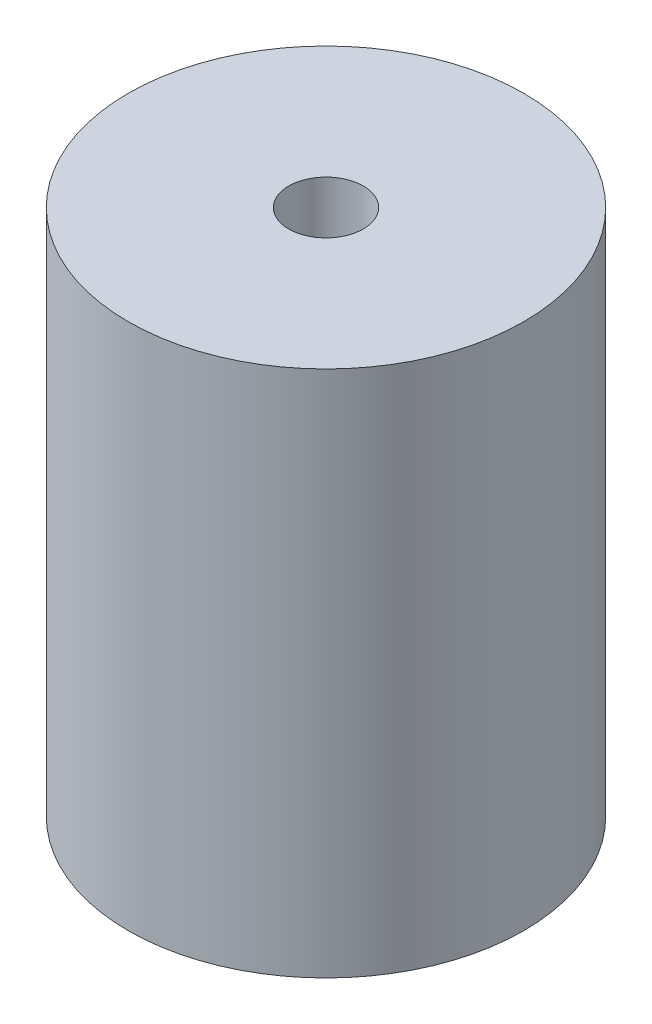
ISO-10303-21;
HEADER;
FILE_DESCRIPTION(('STEP AP214'),'2;1');
FILE_NAME('part.step','',(''),(''),'','','');
FILE_SCHEMA(('AUTOMOTIVE_DESIGN { 1 0 10303 214 1 1 1 1 }'));
ENDSEC;
DATA;
#1=APPLICATION_CONTEXT('core data for automotive mechanical design processes');
#2=APPLICATION_PROTOCOL_DEFINITION('international standard','automotive_design',2000,#1);
#3=PRODUCT_CONTEXT('',#1,'mechanical');
#4=PRODUCT('Part','Part','',(#3));
#5=PRODUCT_RELATED_PRODUCT_CATEGORY('part','',(#4));
#6=PRODUCT_DEFINITION_FORMATION('','',#4);
#7=PRODUCT_DEFINITION_CONTEXT('part definition',#1,'design');
#8=PRODUCT_DEFINITION('design','',#6,#7);
#9=PRODUCT_DEFINITION_SHAPE('','',#8);
#10=(LENGTH_UNIT() NAMED_UNIT(*) SI_UNIT(.MILLI.,.METRE.));
#11=(NAMED_UNIT(*) PLANE_ANGLE_UNIT() SI_UNIT($,.RADIAN.));
#12=(NAMED_UNIT(*) SI_UNIT($,.STERADIAN.) SOLID_ANGLE_UNIT());
#13=UNCERTAINTY_MEASURE_WITH_UNIT(LENGTH_MEASURE(1.E-05),#10,'distance_accuracy_value','');
#14=(GEOMETRIC_REPRESENTATION_CONTEXT(3) GLOBAL_UNCERTAINTY_ASSIGNED_CONTEXT((#13)) GLOBAL_UNIT_ASSIGNED_CONTEXT((#10,
#11,#12)) REPRESENTATION_CONTEXT('',''));
#15=CARTESIAN_POINT('',(0.,0.,0.));
#16=DIRECTION('',(0.,0.,1.));
#17=DIRECTION('',(1.,0.,0.));
#18=AXIS2_PLACEMENT_3D('',#15,#16,#17);
#19=CARTESIAN_POINT('',(0.,101.6,0.));
#20=DIRECTION('',(0.,-1.,0.));
#21=DIRECTION('',(0.,0.,-1.));
#22=AXIS2_PLACEMENT_3D('',#19,#20,#21);
#23=CYLINDRICAL_SURFACE('',#22,38.1);
#24=CARTESIAN_POINT('',(0.,101.6,0.));
#25=DIRECTION('',(0.,1.,0.));
#26=DIRECTION('',(0.,0.,1.));
#27=AXIS2_PLACEMENT_3D('',#24,#25,#26);
#28=CIRCLE('',#27,38.1);
#29=CARTESIAN_POINT('',(0.,101.6,38.1));
#30=VERTEX_POINT('',#29);
#31=EDGE_CURVE('E10',#30,#30,#28,.T.);
#32=ORIENTED_EDGE('',*,*,#31,.F.);
#33=EDGE_LOOP('',(#32));
#34=FACE_BOUND('',#33,.T.);
#35=CARTESIAN_POINT('',(0.,0.,0.));
#36=DIRECTION('',(0.,1.,0.));
#37=DIRECTION('',(0.,0.,1.));
#38=AXIS2_PLACEMENT_3D('',#35,#36,#37);
#39=CIRCLE('',#38,38.1);
#40=CARTESIAN_POINT('',(0.,0.,38.1));
#41=VERTEX_POINT('',#40);
#42=EDGE_CURVE('E34',#41,#41,#39,.T.);
#43=ORIENTED_EDGE('',*,*,#42,.T.);
#44=EDGE_LOOP('',(#43));
#45=FACE_BOUND('',#44,.T.);
#46=ADVANCED_FACE('F31',(#34,#45),#23,.T.);
#47=CARTESIAN_POINT('',(0.,101.6,0.));
#48=DIRECTION('',(0.,1.,0.));
#49=DIRECTION('',(0.,0.,1.));
#50=AXIS2_PLACEMENT_3D('',#47,#48,#49);
#51=PLANE('',#50);
#52=CARTESIAN_POINT('',(0.,101.6,0.));
#53=DIRECTION('',(0.,1.,0.));
#54=DIRECTION('',(0.,0.,1.));
#55=AXIS2_PLACEMENT_3D('',#52,#53,#54);
#56=CIRCLE('',#55,7.18420489685532);
#57=CARTESIAN_POINT('',(0.,101.6,7.18420489685533));
#58=VERTEX_POINT('',#57);
#59=EDGE_CURVE('E43',#58,#58,#56,.T.);
#60=ORIENTED_EDGE('',*,*,#59,.F.);
#61=EDGE_LOOP('',(#60));
#62=FACE_BOUND('',#61,.T.);
#63=ORIENTED_EDGE('',*,*,#31,.T.);
#64=EDGE_LOOP('',(#63));
#65=FACE_BOUND('',#64,.T.);
#66=ADVANCED_FACE('F58',(#62,#65),#51,.T.);
#67=CARTESIAN_POINT('',(0.,0.,0.));
#68=DIRECTION('',(0.,1.,0.));
#69=DIRECTION('',(0.,0.,1.));
#70=AXIS2_PLACEMENT_3D('',#67,#68,#69);
#71=PLANE('',#70);
#72=ORIENTED_EDGE('',*,*,#42,.F.);
#73=EDGE_LOOP('',(#72));
#74=FACE_BOUND('',#73,.T.);
#75=ADVANCED_FACE('F54',(#74),#71,.F.);
#76=CARTESIAN_POINT('',(0.,12.7,0.));
#77=DIRECTION('',(0.,1.,0.));
#78=DIRECTION('',(0.,0.,1.));
#79=AXIS2_PLACEMENT_3D('',#76,#77,#78);
#80=CYLINDRICAL_SURFACE('',#79,7.18420489685532);
#81=CARTESIAN_POINT('',(0.,12.7,0.));
#82=DIRECTION('',(0.,1.,0.));
#83=DIRECTION('',(0.,0.,1.));
#84=AXIS2_PLACEMENT_3D('',#81,#82,#83);
#85=CIRCLE('',#84,7.18420489685532);
#86=CARTESIAN_POINT('',(0.,12.7,7.18420489685533));
#87=VERTEX_POINT('',#86);
#88=EDGE_CURVE('E41',#87,#87,#85,.T.);
#89=ORIENTED_EDGE('',*,*,#88,.F.);
#90=EDGE_LOOP('',(#89));
#91=FACE_BOUND('',#90,.T.);
#92=ORIENTED_EDGE('',*,*,#59,.T.);
#93=EDGE_LOOP('',(#92));
#94=FACE_BOUND('',#93,.T.);
#95=ADVANCED_FACE('F51',(#91,#94),#80,.F.);
#96=CARTESIAN_POINT('',(0.,12.7,0.));
#97=DIRECTION('',(0.,1.,0.));
#98=DIRECTION('',(0.,0.,1.));
#99=AXIS2_PLACEMENT_3D('',#96,#97,#98);
#100=PLANE('',#99);
#101=ORIENTED_EDGE('',*,*,#88,.T.);
#102=EDGE_LOOP('',(#101));
#103=FACE_BOUND('',#102,.T.);
#104=ADVANCED_FACE('F49',(#103),#100,.T.);
#105=CLOSED_SHELL('',(#46,#66,#75,#95,#104));
#106=MANIFOLD_SOLID_BREP('B2',#105);
#107=ADVANCED_BREP_SHAPE_REPRESENTATION('',(#18,#106),#14);
#108=SHAPE_DEFINITION_REPRESENTATION(#9,#107);
ENDSEC;
END-ISO-10303-21;
